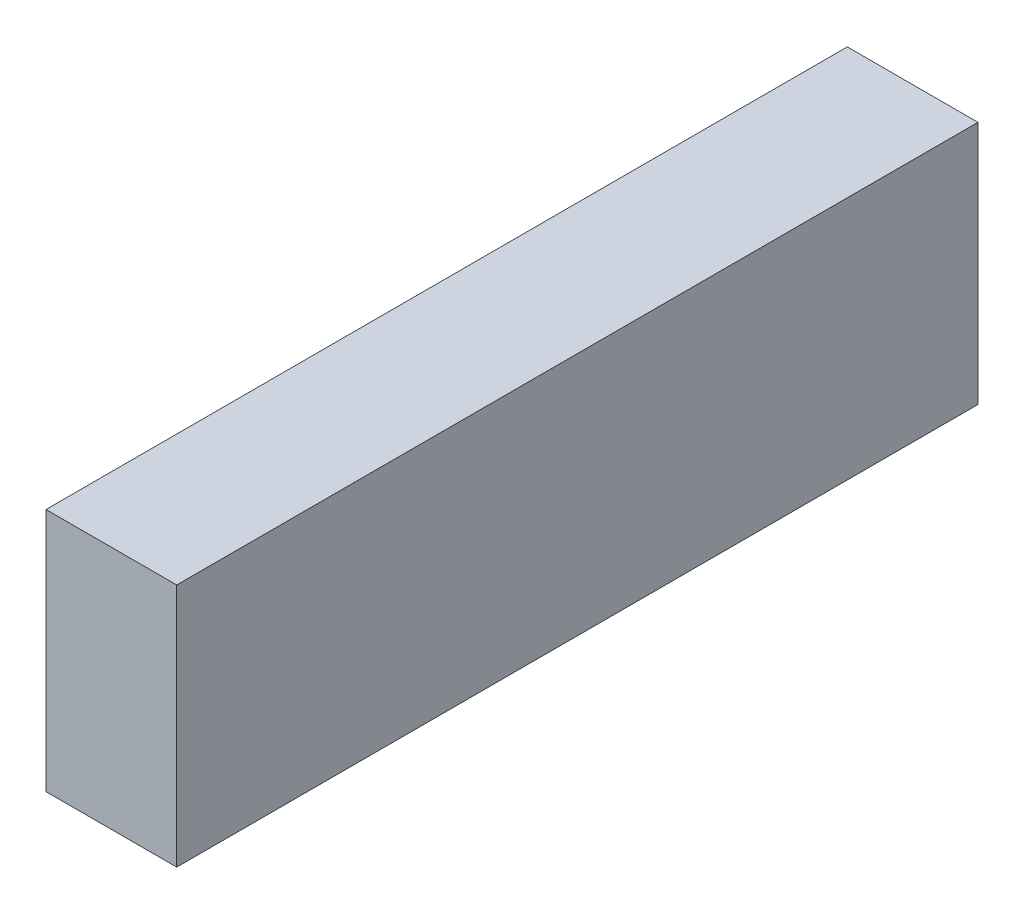
ISO-10303-21;
HEADER;
FILE_DESCRIPTION(('STEP AP214'),'2;1');
FILE_NAME('part.step','',(''),(''),'','','');
FILE_SCHEMA(('AUTOMOTIVE_DESIGN { 1 0 10303 214 1 1 1 1 }'));
ENDSEC;
DATA;
#1=APPLICATION_CONTEXT('core data for automotive mechanical design processes');
#2=APPLICATION_PROTOCOL_DEFINITION('international standard','automotive_design',2000,#1);
#3=PRODUCT_CONTEXT('',#1,'mechanical');
#4=PRODUCT('Part','Part','',(#3));
#5=PRODUCT_RELATED_PRODUCT_CATEGORY('part','',(#4));
#6=PRODUCT_DEFINITION_FORMATION('','',#4);
#7=PRODUCT_DEFINITION_CONTEXT('part definition',#1,'design');
#8=PRODUCT_DEFINITION('design','',#6,#7);
#9=PRODUCT_DEFINITION_SHAPE('','',#8);
#10=(LENGTH_UNIT() NAMED_UNIT(*) SI_UNIT(.MILLI.,.METRE.));
#11=(NAMED_UNIT(*) PLANE_ANGLE_UNIT() SI_UNIT($,.RADIAN.));
#12=(NAMED_UNIT(*) SI_UNIT($,.STERADIAN.) SOLID_ANGLE_UNIT());
#13=UNCERTAINTY_MEASURE_WITH_UNIT(LENGTH_MEASURE(1.E-05),#10,'distance_accuracy_value','');
#14=(GEOMETRIC_REPRESENTATION_CONTEXT(3) GLOBAL_UNCERTAINTY_ASSIGNED_CONTEXT((#13)) GLOBAL_UNIT_ASSIGNED_CONTEXT((#10,
#11,#12)) REPRESENTATION_CONTEXT('',''));
#15=CARTESIAN_POINT('',(0.,0.,0.));
#16=DIRECTION('',(0.,0.,1.));
#17=DIRECTION('',(1.,0.,0.));
#18=AXIS2_PLACEMENT_3D('',#15,#16,#17);
#19=CARTESIAN_POINT('',(-11.5,-21.5,141.));
#20=DIRECTION('',(1.,0.,0.));
#21=DIRECTION('',(0.,0.,-1.));
#22=AXIS2_PLACEMENT_3D('',#19,#20,#21);
#23=PLANE('',#22);
#24=DIRECTION('',(0.,-1.,0.));
#25=VECTOR('',#24,1.);
#26=CARTESIAN_POINT('',(-11.5,-21.5,0.));
#27=LINE('',#26,#25);
#28=CARTESIAN_POINT('',(-11.5,21.5,0.));
#29=VERTEX_POINT('',#28);
#30=CARTESIAN_POINT('',(-11.5,-21.5,0.));
#31=VERTEX_POINT('',#30);
#32=EDGE_CURVE('E101',#29,#31,#27,.T.);
#33=ORIENTED_EDGE('',*,*,#32,.T.);
#34=DIRECTION('',(0.,0.,-1.));
#35=VECTOR('',#34,1.);
#36=CARTESIAN_POINT('',(-11.5,-21.5,141.));
#37=LINE('',#36,#35);
#38=CARTESIAN_POINT('',(-11.5,-21.5,141.));
#39=VERTEX_POINT('',#38);
#40=EDGE_CURVE('E11',#39,#31,#37,.T.);
#41=ORIENTED_EDGE('',*,*,#40,.F.);
#42=DIRECTION('',(0.,-1.,0.));
#43=VECTOR('',#42,1.);
#44=CARTESIAN_POINT('',(-11.5,-21.5,141.));
#45=LINE('',#44,#43);
#46=CARTESIAN_POINT('',(-11.5,21.5,141.));
#47=VERTEX_POINT('',#46);
#48=EDGE_CURVE('E89',#47,#39,#45,.T.);
#49=ORIENTED_EDGE('',*,*,#48,.F.);
#50=DIRECTION('',(0.,0.,-1.));
#51=VECTOR('',#50,1.);
#52=CARTESIAN_POINT('',(-11.5,21.5,141.));
#53=LINE('',#52,#51);
#54=EDGE_CURVE('E97',#47,#29,#53,.T.);
#55=ORIENTED_EDGE('',*,*,#54,.T.);
#56=EDGE_LOOP('',(#33,#41,#49,#55));
#57=FACE_BOUND('',#56,.T.);
#58=ADVANCED_FACE('F38',(#57),#23,.F.);
#59=CARTESIAN_POINT('',(11.5,-21.5,141.));
#60=DIRECTION('',(0.,1.,0.));
#61=DIRECTION('',(-1.,0.,0.));
#62=AXIS2_PLACEMENT_3D('',#59,#60,#61);
#63=PLANE('',#62);
#64=DIRECTION('',(1.,0.,0.));
#65=VECTOR('',#64,1.);
#66=CARTESIAN_POINT('',(11.5,-21.5,0.));
#67=LINE('',#66,#65);
#68=CARTESIAN_POINT('',(11.5,-21.5,0.));
#69=VERTEX_POINT('',#68);
#70=EDGE_CURVE('E93',#31,#69,#67,.T.);
#71=ORIENTED_EDGE('',*,*,#70,.T.);
#72=DIRECTION('',(0.,0.,-1.));
#73=VECTOR('',#72,1.);
#74=CARTESIAN_POINT('',(11.5,-21.5,141.));
#75=LINE('',#74,#73);
#76=CARTESIAN_POINT('',(11.5,-21.5,141.));
#77=VERTEX_POINT('',#76);
#78=EDGE_CURVE('E46',#77,#69,#75,.T.);
#79=ORIENTED_EDGE('',*,*,#78,.F.);
#80=DIRECTION('',(1.,0.,0.));
#81=VECTOR('',#80,1.);
#82=CARTESIAN_POINT('',(11.5,-21.5,141.));
#83=LINE('',#82,#81);
#84=EDGE_CURVE('E84',#39,#77,#83,.T.);
#85=ORIENTED_EDGE('',*,*,#84,.F.);
#86=ORIENTED_EDGE('',*,*,#40,.T.);
#87=EDGE_LOOP('',(#71,#79,#85,#86));
#88=FACE_BOUND('',#87,.T.);
#89=ADVANCED_FACE('F92',(#88),#63,.F.);
#90=CARTESIAN_POINT('',(11.5,-21.5,141.));
#91=DIRECTION('',(-1.,0.,0.));
#92=DIRECTION('',(0.,0.,1.));
#93=AXIS2_PLACEMENT_3D('',#90,#91,#92);
#94=PLANE('',#93);
#95=DIRECTION('',(0.,1.,0.));
#96=VECTOR('',#95,1.);
#97=CARTESIAN_POINT('',(11.5,-21.5,0.));
#98=LINE('',#97,#96);
#99=CARTESIAN_POINT('',(11.5,21.5,0.));
#100=VERTEX_POINT('',#99);
#101=EDGE_CURVE('E71',#69,#100,#98,.T.);
#102=ORIENTED_EDGE('',*,*,#101,.T.);
#103=DIRECTION('',(0.,0.,-1.));
#104=VECTOR('',#103,1.);
#105=CARTESIAN_POINT('',(11.5,21.5,141.));
#106=LINE('',#105,#104);
#107=CARTESIAN_POINT('',(11.5,21.5,141.));
#108=VERTEX_POINT('',#107);
#109=EDGE_CURVE('E94',#108,#100,#106,.T.);
#110=ORIENTED_EDGE('',*,*,#109,.F.);
#111=DIRECTION('',(0.,1.,0.));
#112=VECTOR('',#111,1.);
#113=CARTESIAN_POINT('',(11.5,-21.5,141.));
#114=LINE('',#113,#112);
#115=EDGE_CURVE('E87',#77,#108,#114,.T.);
#116=ORIENTED_EDGE('',*,*,#115,.F.);
#117=ORIENTED_EDGE('',*,*,#78,.T.);
#118=EDGE_LOOP('',(#102,#110,#116,#117));
#119=FACE_BOUND('',#118,.T.);
#120=ADVANCED_FACE('F95',(#119),#94,.F.);
#121=CARTESIAN_POINT('',(11.5,21.5,141.));
#122=DIRECTION('',(0.,-1.,0.));
#123=DIRECTION('',(1.,0.,0.));
#124=AXIS2_PLACEMENT_3D('',#121,#122,#123);
#125=PLANE('',#124);
#126=DIRECTION('',(-1.,0.,0.));
#127=VECTOR('',#126,1.);
#128=CARTESIAN_POINT('',(11.5,21.5,0.));
#129=LINE('',#128,#127);
#130=EDGE_CURVE('E77',#100,#29,#129,.T.);
#131=ORIENTED_EDGE('',*,*,#130,.T.);
#132=ORIENTED_EDGE('',*,*,#54,.F.);
#133=DIRECTION('',(-1.,0.,0.));
#134=VECTOR('',#133,1.);
#135=CARTESIAN_POINT('',(11.5,21.5,141.));
#136=LINE('',#135,#134);
#137=EDGE_CURVE('E54',#108,#47,#136,.T.);
#138=ORIENTED_EDGE('',*,*,#137,.F.);
#139=ORIENTED_EDGE('',*,*,#109,.T.);
#140=EDGE_LOOP('',(#131,#132,#138,#139));
#141=FACE_BOUND('',#140,.T.);
#142=ADVANCED_FACE('F108',(#141),#125,.F.);
#143=CARTESIAN_POINT('',(0.,0.,141.));
#144=DIRECTION('',(0.,0.,1.));
#145=DIRECTION('',(1.,0.,0.));
#146=AXIS2_PLACEMENT_3D('',#143,#144,#145);
#147=PLANE('',#146);
#148=ORIENTED_EDGE('',*,*,#48,.T.);
#149=ORIENTED_EDGE('',*,*,#84,.T.);
#150=ORIENTED_EDGE('',*,*,#115,.T.);
#151=ORIENTED_EDGE('',*,*,#137,.T.);
#152=EDGE_LOOP('',(#148,#149,#150,#151));
#153=FACE_BOUND('',#152,.T.);
#154=ADVANCED_FACE('F85',(#153),#147,.T.);
#155=CARTESIAN_POINT('',(0.,0.,0.));
#156=DIRECTION('',(0.,0.,1.));
#157=DIRECTION('',(1.,0.,0.));
#158=AXIS2_PLACEMENT_3D('',#155,#156,#157);
#159=PLANE('',#158);
#160=ORIENTED_EDGE('',*,*,#32,.F.);
#161=ORIENTED_EDGE('',*,*,#130,.F.);
#162=ORIENTED_EDGE('',*,*,#101,.F.);
#163=ORIENTED_EDGE('',*,*,#70,.F.);
#164=EDGE_LOOP('',(#160,#161,#162,#163));
#165=FACE_BOUND('',#164,.T.);
#166=ADVANCED_FACE('F111',(#165),#159,.F.);
#167=CLOSED_SHELL('',(#58,#89,#120,#142,#154,#166));
#168=MANIFOLD_SOLID_BREP('B2',#167);
#169=ADVANCED_BREP_SHAPE_REPRESENTATION('',(#18,#168),#14);
#170=SHAPE_DEFINITION_REPRESENTATION(#9,#169);
ENDSEC;
END-ISO-10303-21;
